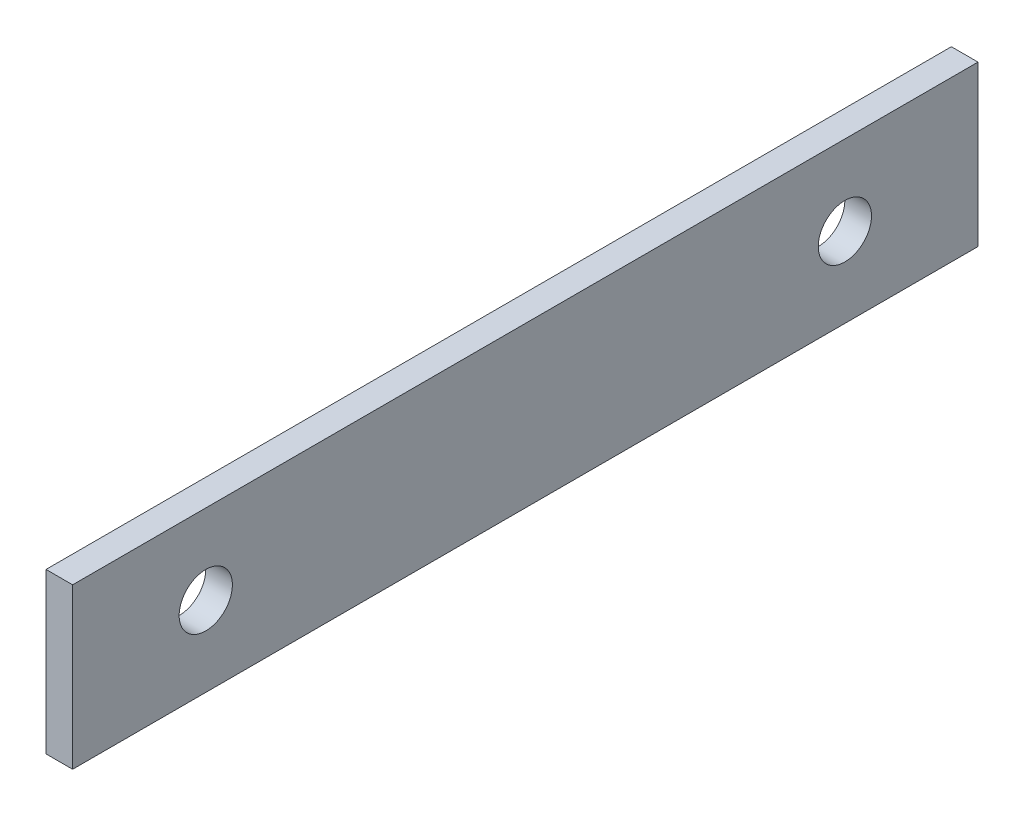
ISO-10303-21;
HEADER;
FILE_DESCRIPTION(('STEP AP214'),'2;1');
FILE_NAME('part.step','',(''),(''),'','','');
FILE_SCHEMA(('AUTOMOTIVE_DESIGN { 1 0 10303 214 1 1 1 1 }'));
ENDSEC;
DATA;
#1=APPLICATION_CONTEXT('core data for automotive mechanical design processes');
#2=APPLICATION_PROTOCOL_DEFINITION('international standard','automotive_design',2000,#1);
#3=PRODUCT_CONTEXT('',#1,'mechanical');
#4=PRODUCT('Part','Part','',(#3));
#5=PRODUCT_RELATED_PRODUCT_CATEGORY('part','',(#4));
#6=PRODUCT_DEFINITION_FORMATION('','',#4);
#7=PRODUCT_DEFINITION_CONTEXT('part definition',#1,'design');
#8=PRODUCT_DEFINITION('design','',#6,#7);
#9=PRODUCT_DEFINITION_SHAPE('','',#8);
#10=(LENGTH_UNIT() NAMED_UNIT(*) SI_UNIT(.MILLI.,.METRE.));
#11=(NAMED_UNIT(*) PLANE_ANGLE_UNIT() SI_UNIT($,.RADIAN.));
#12=(NAMED_UNIT(*) SI_UNIT($,.STERADIAN.) SOLID_ANGLE_UNIT());
#13=UNCERTAINTY_MEASURE_WITH_UNIT(LENGTH_MEASURE(1.E-05),#10,'distance_accuracy_value','');
#14=(GEOMETRIC_REPRESENTATION_CONTEXT(3) GLOBAL_UNCERTAINTY_ASSIGNED_CONTEXT((#13)) GLOBAL_UNIT_ASSIGNED_CONTEXT((#10,
#11,#12)) REPRESENTATION_CONTEXT('',''));
#15=CARTESIAN_POINT('',(0.,0.,0.));
#16=DIRECTION('',(0.,0.,1.));
#17=DIRECTION('',(1.,0.,0.));
#18=AXIS2_PLACEMENT_3D('',#15,#16,#17);
#19=CARTESIAN_POINT('',(5.,0.,0.));
#20=DIRECTION('',(-1.,0.,0.));
#21=DIRECTION('',(0.,0.,1.));
#22=AXIS2_PLACEMENT_3D('',#19,#20,#21);
#23=PLANE('',#22);
#24=DIRECTION('',(0.,-1.,0.));
#25=VECTOR('',#24,1.);
#26=CARTESIAN_POINT('',(5.,0.,0.));
#27=LINE('',#26,#25);
#28=CARTESIAN_POINT('',(5.,30.,0.));
#29=VERTEX_POINT('',#28);
#30=CARTESIAN_POINT('',(5.,0.,0.));
#31=VERTEX_POINT('',#30);
#32=EDGE_CURVE('E86',#29,#31,#27,.T.);
#33=ORIENTED_EDGE('',*,*,#32,.T.);
#34=DIRECTION('',(0.,0.,-1.));
#35=VECTOR('',#34,1.);
#36=CARTESIAN_POINT('',(5.,0.,0.));
#37=LINE('',#36,#35);
#38=CARTESIAN_POINT('',(5.,0.,-170.));
#39=VERTEX_POINT('',#38);
#40=EDGE_CURVE('E81',#31,#39,#37,.T.);
#41=ORIENTED_EDGE('',*,*,#40,.T.);
#42=DIRECTION('',(0.,1.,0.));
#43=VECTOR('',#42,1.);
#44=CARTESIAN_POINT('',(5.,0.,-170.));
#45=LINE('',#44,#43);
#46=CARTESIAN_POINT('',(5.,30.,-170.));
#47=VERTEX_POINT('',#46);
#48=EDGE_CURVE('E84',#39,#47,#45,.T.);
#49=ORIENTED_EDGE('',*,*,#48,.T.);
#50=DIRECTION('',(0.,0.,1.));
#51=VECTOR('',#50,1.);
#52=CARTESIAN_POINT('',(5.,30.,0.));
#53=LINE('',#52,#51);
#54=EDGE_CURVE('E51',#47,#29,#53,.T.);
#55=ORIENTED_EDGE('',*,*,#54,.T.);
#56=EDGE_LOOP('',(#33,#41,#49,#55));
#57=FACE_BOUND('',#56,.T.);
#58=CARTESIAN_POINT('',(5.,15.,-25.));
#59=DIRECTION('',(1.,0.,0.));
#60=DIRECTION('',(0.,0.,-1.));
#61=AXIS2_PLACEMENT_3D('',#58,#59,#60);
#62=CIRCLE('',#61,5.);
#63=CARTESIAN_POINT('',(5.,15.,-30.));
#64=VERTEX_POINT('',#63);
#65=EDGE_CURVE('E101',#64,#64,#62,.T.);
#66=ORIENTED_EDGE('',*,*,#65,.F.);
#67=EDGE_LOOP('',(#66));
#68=FACE_BOUND('',#67,.T.);
#69=CARTESIAN_POINT('',(5.,15.,-145.));
#70=DIRECTION('',(1.,0.,0.));
#71=DIRECTION('',(0.,0.,-1.));
#72=AXIS2_PLACEMENT_3D('',#69,#70,#71);
#73=CIRCLE('',#72,5.00000000000002);
#74=CARTESIAN_POINT('',(5.,15.,-150.));
#75=VERTEX_POINT('',#74);
#76=EDGE_CURVE('E116',#75,#75,#73,.T.);
#77=ORIENTED_EDGE('',*,*,#76,.F.);
#78=EDGE_LOOP('',(#77));
#79=FACE_BOUND('',#78,.T.);
#80=ADVANCED_FACE('F34',(#57,#68,#79),#23,.F.);
#81=CARTESIAN_POINT('',(0.,0.,0.));
#82=DIRECTION('',(-1.,0.,0.));
#83=DIRECTION('',(0.,0.,1.));
#84=AXIS2_PLACEMENT_3D('',#81,#82,#83);
#85=PLANE('',#84);
#86=CARTESIAN_POINT('',(0.,15.,-25.));
#87=DIRECTION('',(1.,0.,0.));
#88=DIRECTION('',(0.,0.,-1.));
#89=AXIS2_PLACEMENT_3D('',#86,#87,#88);
#90=CIRCLE('',#89,5.);
#91=CARTESIAN_POINT('',(0.,15.,-30.));
#92=VERTEX_POINT('',#91);
#93=EDGE_CURVE('E113',#92,#92,#90,.T.);
#94=ORIENTED_EDGE('',*,*,#93,.T.);
#95=EDGE_LOOP('',(#94));
#96=FACE_BOUND('',#95,.T.);
#97=DIRECTION('',(0.,-1.,0.));
#98=VECTOR('',#97,1.);
#99=CARTESIAN_POINT('',(0.,0.,0.));
#100=LINE('',#99,#98);
#101=CARTESIAN_POINT('',(0.,30.,0.));
#102=VERTEX_POINT('',#101);
#103=CARTESIAN_POINT('',(0.,0.,0.));
#104=VERTEX_POINT('',#103);
#105=EDGE_CURVE('E98',#102,#104,#100,.T.);
#106=ORIENTED_EDGE('',*,*,#105,.F.);
#107=DIRECTION('',(0.,0.,1.));
#108=VECTOR('',#107,1.);
#109=CARTESIAN_POINT('',(0.,30.,0.));
#110=LINE('',#109,#108);
#111=CARTESIAN_POINT('',(0.,30.,-170.));
#112=VERTEX_POINT('',#111);
#113=EDGE_CURVE('E74',#112,#102,#110,.T.);
#114=ORIENTED_EDGE('',*,*,#113,.F.);
#115=DIRECTION('',(0.,1.,0.));
#116=VECTOR('',#115,1.);
#117=CARTESIAN_POINT('',(0.,0.,-170.));
#118=LINE('',#117,#116);
#119=CARTESIAN_POINT('',(0.,0.,-170.));
#120=VERTEX_POINT('',#119);
#121=EDGE_CURVE('E68',#120,#112,#118,.T.);
#122=ORIENTED_EDGE('',*,*,#121,.F.);
#123=DIRECTION('',(0.,0.,-1.));
#124=VECTOR('',#123,1.);
#125=CARTESIAN_POINT('',(0.,0.,0.));
#126=LINE('',#125,#124);
#127=EDGE_CURVE('E90',#104,#120,#126,.T.);
#128=ORIENTED_EDGE('',*,*,#127,.F.);
#129=EDGE_LOOP('',(#106,#114,#122,#128));
#130=FACE_BOUND('',#129,.T.);
#131=CARTESIAN_POINT('',(0.,15.,-145.));
#132=DIRECTION('',(1.,0.,0.));
#133=DIRECTION('',(0.,0.,-1.));
#134=AXIS2_PLACEMENT_3D('',#131,#132,#133);
#135=CIRCLE('',#134,5.00000000000002);
#136=CARTESIAN_POINT('',(0.,15.,-150.));
#137=VERTEX_POINT('',#136);
#138=EDGE_CURVE('E119',#137,#137,#135,.T.);
#139=ORIENTED_EDGE('',*,*,#138,.T.);
#140=EDGE_LOOP('',(#139));
#141=FACE_BOUND('',#140,.T.);
#142=ADVANCED_FACE('F109',(#96,#130,#141),#85,.T.);
#143=CARTESIAN_POINT('',(5.,0.,0.));
#144=DIRECTION('',(0.,0.,-1.));
#145=DIRECTION('',(-1.,0.,0.));
#146=AXIS2_PLACEMENT_3D('',#143,#144,#145);
#147=PLANE('',#146);
#148=ORIENTED_EDGE('',*,*,#105,.T.);
#149=DIRECTION('',(-1.,0.,0.));
#150=VECTOR('',#149,1.);
#151=CARTESIAN_POINT('',(5.,0.,0.));
#152=LINE('',#151,#150);
#153=EDGE_CURVE('E11',#31,#104,#152,.T.);
#154=ORIENTED_EDGE('',*,*,#153,.F.);
#155=ORIENTED_EDGE('',*,*,#32,.F.);
#156=DIRECTION('',(-1.,0.,0.));
#157=VECTOR('',#156,1.);
#158=CARTESIAN_POINT('',(5.,30.,0.));
#159=LINE('',#158,#157);
#160=EDGE_CURVE('E94',#29,#102,#159,.T.);
#161=ORIENTED_EDGE('',*,*,#160,.T.);
#162=EDGE_LOOP('',(#148,#154,#155,#161));
#163=FACE_BOUND('',#162,.T.);
#164=ADVANCED_FACE('F36',(#163),#147,.F.);
#165=CARTESIAN_POINT('',(5.,0.,0.));
#166=DIRECTION('',(0.,1.,0.));
#167=DIRECTION('',(0.,0.,1.));
#168=AXIS2_PLACEMENT_3D('',#165,#166,#167);
#169=PLANE('',#168);
#170=ORIENTED_EDGE('',*,*,#127,.T.);
#171=DIRECTION('',(-1.,0.,0.));
#172=VECTOR('',#171,1.);
#173=CARTESIAN_POINT('',(5.,0.,-170.));
#174=LINE('',#173,#172);
#175=EDGE_CURVE('E43',#39,#120,#174,.T.);
#176=ORIENTED_EDGE('',*,*,#175,.F.);
#177=ORIENTED_EDGE('',*,*,#40,.F.);
#178=ORIENTED_EDGE('',*,*,#153,.T.);
#179=EDGE_LOOP('',(#170,#176,#177,#178));
#180=FACE_BOUND('',#179,.T.);
#181=ADVANCED_FACE('F89',(#180),#169,.F.);
#182=CARTESIAN_POINT('',(5.,0.,-170.));
#183=DIRECTION('',(0.,0.,1.));
#184=DIRECTION('',(1.,0.,0.));
#185=AXIS2_PLACEMENT_3D('',#182,#183,#184);
#186=PLANE('',#185);
#187=ORIENTED_EDGE('',*,*,#121,.T.);
#188=DIRECTION('',(-1.,0.,0.));
#189=VECTOR('',#188,1.);
#190=CARTESIAN_POINT('',(5.,30.,-170.));
#191=LINE('',#190,#189);
#192=EDGE_CURVE('E91',#47,#112,#191,.T.);
#193=ORIENTED_EDGE('',*,*,#192,.F.);
#194=ORIENTED_EDGE('',*,*,#48,.F.);
#195=ORIENTED_EDGE('',*,*,#175,.T.);
#196=EDGE_LOOP('',(#187,#193,#194,#195));
#197=FACE_BOUND('',#196,.T.);
#198=ADVANCED_FACE('F92',(#197),#186,.F.);
#199=CARTESIAN_POINT('',(5.,30.,0.));
#200=DIRECTION('',(0.,-1.,0.));
#201=DIRECTION('',(0.,0.,-1.));
#202=AXIS2_PLACEMENT_3D('',#199,#200,#201);
#203=PLANE('',#202);
#204=ORIENTED_EDGE('',*,*,#113,.T.);
#205=ORIENTED_EDGE('',*,*,#160,.F.);
#206=ORIENTED_EDGE('',*,*,#54,.F.);
#207=ORIENTED_EDGE('',*,*,#192,.T.);
#208=EDGE_LOOP('',(#204,#205,#206,#207));
#209=FACE_BOUND('',#208,.T.);
#210=ADVANCED_FACE('F106',(#209),#203,.F.);
#211=CARTESIAN_POINT('',(5.,15.,-25.));
#212=DIRECTION('',(-1.,0.,0.));
#213=DIRECTION('',(0.,0.,1.));
#214=AXIS2_PLACEMENT_3D('',#211,#212,#213);
#215=CYLINDRICAL_SURFACE('',#214,5.);
#216=ORIENTED_EDGE('',*,*,#65,.T.);
#217=EDGE_LOOP('',(#216));
#218=FACE_BOUND('',#217,.T.);
#219=ORIENTED_EDGE('',*,*,#93,.F.);
#220=EDGE_LOOP('',(#219));
#221=FACE_BOUND('',#220,.T.);
#222=ADVANCED_FACE('F136',(#218,#221),#215,.F.);
#223=CARTESIAN_POINT('',(5.,15.,-145.));
#224=DIRECTION('',(-1.,0.,0.));
#225=DIRECTION('',(0.,0.,1.));
#226=AXIS2_PLACEMENT_3D('',#223,#224,#225);
#227=CYLINDRICAL_SURFACE('',#226,5.00000000000002);
#228=ORIENTED_EDGE('',*,*,#76,.T.);
#229=EDGE_LOOP('',(#228));
#230=FACE_BOUND('',#229,.T.);
#231=ORIENTED_EDGE('',*,*,#138,.F.);
#232=EDGE_LOOP('',(#231));
#233=FACE_BOUND('',#232,.T.);
#234=ADVANCED_FACE('F125',(#230,#233),#227,.F.);
#235=CLOSED_SHELL('',(#80,#142,#164,#181,#198,#210,#222,#234));
#236=MANIFOLD_SOLID_BREP('B2',#235);
#237=ADVANCED_BREP_SHAPE_REPRESENTATION('',(#18,#236),#14);
#238=SHAPE_DEFINITION_REPRESENTATION(#9,#237);
ENDSEC;
END-ISO-10303-21;
